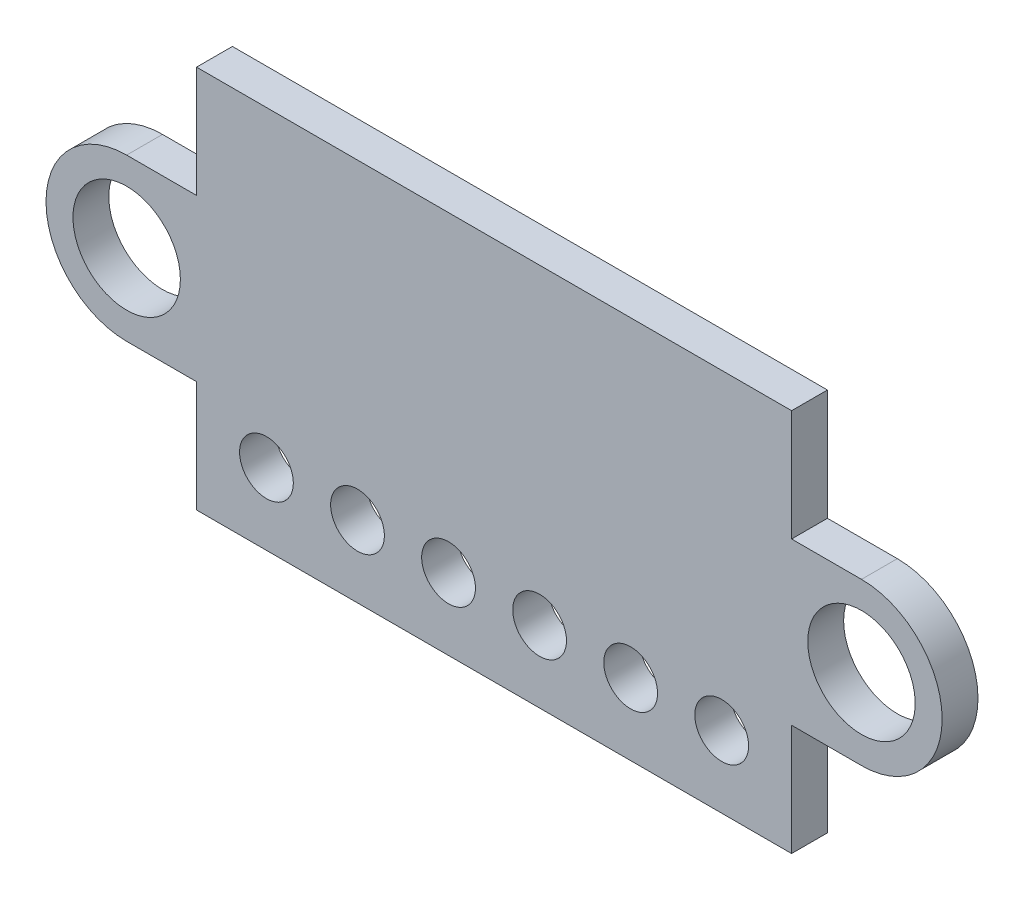
ISO-10303-21;
HEADER;
FILE_DESCRIPTION(('STEP AP214'),'2;1');
FILE_NAME('part.step','',(''),(''),'','','');
FILE_SCHEMA(('AUTOMOTIVE_DESIGN { 1 0 10303 214 1 1 1 1 }'));
ENDSEC;
DATA;
#1=APPLICATION_CONTEXT('core data for automotive mechanical design processes');
#2=APPLICATION_PROTOCOL_DEFINITION('international standard','automotive_design',2000,#1);
#3=PRODUCT_CONTEXT('',#1,'mechanical');
#4=PRODUCT('Part','Part','',(#3));
#5=PRODUCT_RELATED_PRODUCT_CATEGORY('part','',(#4));
#6=PRODUCT_DEFINITION_FORMATION('','',#4);
#7=PRODUCT_DEFINITION_CONTEXT('part definition',#1,'design');
#8=PRODUCT_DEFINITION('design','',#6,#7);
#9=PRODUCT_DEFINITION_SHAPE('','',#8);
#10=(LENGTH_UNIT() NAMED_UNIT(*) SI_UNIT(.MILLI.,.METRE.));
#11=(NAMED_UNIT(*) PLANE_ANGLE_UNIT() SI_UNIT($,.RADIAN.));
#12=(NAMED_UNIT(*) SI_UNIT($,.STERADIAN.) SOLID_ANGLE_UNIT());
#13=UNCERTAINTY_MEASURE_WITH_UNIT(LENGTH_MEASURE(1.E-05),#10,'distance_accuracy_value','');
#14=(GEOMETRIC_REPRESENTATION_CONTEXT(3) GLOBAL_UNCERTAINTY_ASSIGNED_CONTEXT((#13)) GLOBAL_UNIT_ASSIGNED_CONTEXT((#10,
#11,#12)) REPRESENTATION_CONTEXT('',''));
#15=CARTESIAN_POINT('',(0.,0.,0.));
#16=DIRECTION('',(0.,0.,1.));
#17=DIRECTION('',(1.,0.,0.));
#18=AXIS2_PLACEMENT_3D('',#15,#16,#17);
#19=CARTESIAN_POINT('',(-10.25,0.,0.));
#20=DIRECTION('',(0.,0.,1.));
#21=DIRECTION('',(1.,0.,0.));
#22=AXIS2_PLACEMENT_3D('',#19,#20,#21);
#23=PLANE('',#22);
#24=DIRECTION('',(0.,1.,0.));
#25=VECTOR('',#24,1.);
#26=CARTESIAN_POINT('',(-0.658776097833584,1.24983059149965,0.));
#27=LINE('',#26,#25);
#28=CARTESIAN_POINT('',(-0.658776097833584,-0.908813071564649,0.));
#29=VERTEX_POINT('',#28);
#30=CARTESIAN_POINT('',(-0.658776097833585,1.24983059149965,0.));
#31=VERTEX_POINT('',#30);
#32=EDGE_CURVE('E192',#29,#31,#27,.T.);
#33=ORIENTED_EDGE('',*,*,#32,.F.);
#34=DIRECTION('',(-1.,0.,0.));
#35=VECTOR('',#34,1.);
#36=CARTESIAN_POINT('',(1.22798253783359,-0.908813071564649,0.));
#37=LINE('',#36,#35);
#38=CARTESIAN_POINT('',(1.22798253783359,-0.908813071564649,0.));
#39=VERTEX_POINT('',#38);
#40=EDGE_CURVE('E205',#39,#29,#37,.T.);
#41=ORIENTED_EDGE('',*,*,#40,.F.);
#42=DIRECTION('',(0.,-1.,0.));
#43=VECTOR('',#42,1.);
#44=CARTESIAN_POINT('',(1.22798253783359,1.24983059149965,0.));
#45=LINE('',#44,#43);
#46=CARTESIAN_POINT('',(1.22798253783359,1.24983059149965,0.));
#47=VERTEX_POINT('',#46);
#48=EDGE_CURVE('E214',#47,#39,#45,.T.);
#49=ORIENTED_EDGE('',*,*,#48,.F.);
#50=DIRECTION('',(1.,0.,0.));
#51=VECTOR('',#50,1.);
#52=CARTESIAN_POINT('',(1.22798253783359,1.24983059149965,0.));
#53=LINE('',#52,#51);
#54=EDGE_CURVE('E195',#31,#47,#53,.T.);
#55=ORIENTED_EDGE('',*,*,#54,.F.);
#56=EDGE_LOOP('',(#33,#41,#49,#55));
#57=FACE_BOUND('',#56,.T.);
#58=DIRECTION('',(0.,1.,0.));
#59=VECTOR('',#58,1.);
#60=CARTESIAN_POINT('',(8.3,-2.25,0.));
#61=LINE('',#60,#59);
#62=CARTESIAN_POINT('',(8.3,-5.35,0.));
#63=VERTEX_POINT('',#62);
#64=CARTESIAN_POINT('',(8.3,-2.25,0.));
#65=VERTEX_POINT('',#64);
#66=EDGE_CURVE('E276',#63,#65,#61,.T.);
#67=ORIENTED_EDGE('',*,*,#66,.F.);
#68=DIRECTION('',(1.,0.,0.));
#69=VECTOR('',#68,1.);
#70=CARTESIAN_POINT('',(-8.3,-5.35,0.));
#71=LINE('',#70,#69);
#72=CARTESIAN_POINT('',(-8.3,-5.35,0.));
#73=VERTEX_POINT('',#72);
#74=EDGE_CURVE('E283',#73,#63,#71,.T.);
#75=ORIENTED_EDGE('',*,*,#74,.F.);
#76=DIRECTION('',(0.,-1.,0.));
#77=VECTOR('',#76,1.);
#78=CARTESIAN_POINT('',(-8.3,-2.25,0.));
#79=LINE('',#78,#77);
#80=CARTESIAN_POINT('',(-8.3,-2.25,0.));
#81=VERTEX_POINT('',#80);
#82=EDGE_CURVE('E326',#81,#73,#79,.T.);
#83=ORIENTED_EDGE('',*,*,#82,.F.);
#84=DIRECTION('',(1.,0.,0.));
#85=VECTOR('',#84,1.);
#86=CARTESIAN_POINT('',(-10.25,-2.25000000000001,0.));
#87=LINE('',#86,#85);
#88=CARTESIAN_POINT('',(-10.25,-2.25000000000001,0.));
#89=VERTEX_POINT('',#88);
#90=EDGE_CURVE('E324',#89,#81,#87,.T.);
#91=ORIENTED_EDGE('',*,*,#90,.F.);
#92=CARTESIAN_POINT('',(-10.25,0.,0.));
#93=DIRECTION('',(0.,0.,1.));
#94=DIRECTION('',(1.,0.,0.));
#95=AXIS2_PLACEMENT_3D('',#92,#93,#94);
#96=CIRCLE('',#95,2.25);
#97=CARTESIAN_POINT('',(-10.25,2.25,0.));
#98=VERTEX_POINT('',#97);
#99=EDGE_CURVE('E322',#98,#89,#96,.T.);
#100=ORIENTED_EDGE('',*,*,#99,.F.);
#101=DIRECTION('',(-1.,0.,0.));
#102=VECTOR('',#101,1.);
#103=CARTESIAN_POINT('',(-10.25,2.25,0.));
#104=LINE('',#103,#102);
#105=CARTESIAN_POINT('',(-8.3,2.25,0.));
#106=VERTEX_POINT('',#105);
#107=EDGE_CURVE('E320',#106,#98,#104,.T.);
#108=ORIENTED_EDGE('',*,*,#107,.F.);
#109=DIRECTION('',(0.,-1.,0.));
#110=VECTOR('',#109,1.);
#111=CARTESIAN_POINT('',(-8.3,5.35,0.));
#112=LINE('',#111,#110);
#113=CARTESIAN_POINT('',(-8.3,5.35,0.));
#114=VERTEX_POINT('',#113);
#115=EDGE_CURVE('E318',#114,#106,#112,.T.);
#116=ORIENTED_EDGE('',*,*,#115,.F.);
#117=DIRECTION('',(-1.,0.,0.));
#118=VECTOR('',#117,1.);
#119=CARTESIAN_POINT('',(-8.3,5.35,0.));
#120=LINE('',#119,#118);
#121=CARTESIAN_POINT('',(8.3,5.35,0.));
#122=VERTEX_POINT('',#121);
#123=EDGE_CURVE('E316',#122,#114,#120,.T.);
#124=ORIENTED_EDGE('',*,*,#123,.F.);
#125=DIRECTION('',(0.,1.,0.));
#126=VECTOR('',#125,1.);
#127=CARTESIAN_POINT('',(8.3,5.35,0.));
#128=LINE('',#127,#126);
#129=CARTESIAN_POINT('',(8.3,2.25,0.));
#130=VERTEX_POINT('',#129);
#131=EDGE_CURVE('E314',#130,#122,#128,.T.);
#132=ORIENTED_EDGE('',*,*,#131,.F.);
#133=DIRECTION('',(-1.,0.,0.));
#134=VECTOR('',#133,1.);
#135=CARTESIAN_POINT('',(10.25,2.25,0.));
#136=LINE('',#135,#134);
#137=CARTESIAN_POINT('',(10.25,2.25,0.));
#138=VERTEX_POINT('',#137);
#139=EDGE_CURVE('E312',#138,#130,#136,.T.);
#140=ORIENTED_EDGE('',*,*,#139,.F.);
#141=CARTESIAN_POINT('',(10.25,0.,0.));
#142=DIRECTION('',(0.,0.,1.));
#143=DIRECTION('',(-1.,0.,0.));
#144=AXIS2_PLACEMENT_3D('',#141,#142,#143);
#145=CIRCLE('',#144,2.25);
#146=CARTESIAN_POINT('',(10.25,-2.25,0.));
#147=VERTEX_POINT('',#146);
#148=EDGE_CURVE('E310',#147,#138,#145,.T.);
#149=ORIENTED_EDGE('',*,*,#148,.F.);
#150=DIRECTION('',(1.,0.,0.));
#151=VECTOR('',#150,1.);
#152=CARTESIAN_POINT('',(10.25,-2.25,0.));
#153=LINE('',#152,#151);
#154=EDGE_CURVE('E308',#65,#147,#153,.T.);
#155=ORIENTED_EDGE('',*,*,#154,.F.);
#156=EDGE_LOOP('',(#67,#75,#83,#91,#100,#108,#116,#124,#132,#140,#149,#155));
#157=FACE_BOUND('',#156,.T.);
#158=CARTESIAN_POINT('',(-10.25,0.,0.));
#159=DIRECTION('',(0.,0.,1.));
#160=DIRECTION('',(1.,0.,0.));
#161=AXIS2_PLACEMENT_3D('',#158,#159,#160);
#162=CIRCLE('',#161,1.49831118754806);
#163=CARTESIAN_POINT('',(-8.75168881245194,0.,0.));
#164=VERTEX_POINT('',#163);
#165=EDGE_CURVE('E270',#164,#164,#162,.T.);
#166=ORIENTED_EDGE('',*,*,#165,.T.);
#167=EDGE_LOOP('',(#166));
#168=FACE_BOUND('',#167,.T.);
#169=CARTESIAN_POINT('',(10.25,0.,0.));
#170=DIRECTION('',(0.,0.,1.));
#171=DIRECTION('',(-1.,0.,0.));
#172=AXIS2_PLACEMENT_3D('',#169,#170,#171);
#173=CIRCLE('',#172,1.49831118754806);
#174=CARTESIAN_POINT('',(8.75168881245194,0.,0.));
#175=VERTEX_POINT('',#174);
#176=EDGE_CURVE('E264',#175,#175,#173,.T.);
#177=ORIENTED_EDGE('',*,*,#176,.T.);
#178=EDGE_LOOP('',(#177));
#179=FACE_BOUND('',#178,.T.);
#180=CARTESIAN_POINT('',(-6.35,-3.35,0.));
#181=DIRECTION('',(0.,0.,1.));
#182=DIRECTION('',(1.,0.,0.));
#183=AXIS2_PLACEMENT_3D('',#180,#181,#182);
#184=CIRCLE('',#183,0.749999999999998);
#185=CARTESIAN_POINT('',(-5.6,-3.35,0.));
#186=VERTEX_POINT('',#185);
#187=EDGE_CURVE('E258',#186,#186,#184,.T.);
#188=ORIENTED_EDGE('',*,*,#187,.T.);
#189=EDGE_LOOP('',(#188));
#190=FACE_BOUND('',#189,.T.);
#191=CARTESIAN_POINT('',(-3.81,-3.35,0.));
#192=DIRECTION('',(0.,0.,1.));
#193=DIRECTION('',(1.,0.,0.));
#194=AXIS2_PLACEMENT_3D('',#191,#192,#193);
#195=CIRCLE('',#194,0.75);
#196=CARTESIAN_POINT('',(-3.06,-3.35,0.));
#197=VERTEX_POINT('',#196);
#198=EDGE_CURVE('E252',#197,#197,#195,.T.);
#199=ORIENTED_EDGE('',*,*,#198,.T.);
#200=EDGE_LOOP('',(#199));
#201=FACE_BOUND('',#200,.T.);
#202=CARTESIAN_POINT('',(-1.27,-3.35,0.));
#203=DIRECTION('',(0.,0.,1.));
#204=DIRECTION('',(1.,0.,0.));
#205=AXIS2_PLACEMENT_3D('',#202,#203,#204);
#206=CIRCLE('',#205,0.75);
#207=CARTESIAN_POINT('',(-0.52,-3.35,0.));
#208=VERTEX_POINT('',#207);
#209=EDGE_CURVE('E246',#208,#208,#206,.T.);
#210=ORIENTED_EDGE('',*,*,#209,.T.);
#211=EDGE_LOOP('',(#210));
#212=FACE_BOUND('',#211,.T.);
#213=CARTESIAN_POINT('',(1.27,-3.35,0.));
#214=DIRECTION('',(0.,0.,1.));
#215=DIRECTION('',(1.,0.,0.));
#216=AXIS2_PLACEMENT_3D('',#213,#214,#215);
#217=CIRCLE('',#216,0.750000000000001);
#218=CARTESIAN_POINT('',(2.02,-3.35,0.));
#219=VERTEX_POINT('',#218);
#220=EDGE_CURVE('E240',#219,#219,#217,.T.);
#221=ORIENTED_EDGE('',*,*,#220,.T.);
#222=EDGE_LOOP('',(#221));
#223=FACE_BOUND('',#222,.T.);
#224=CARTESIAN_POINT('',(3.81,-3.35,0.));
#225=DIRECTION('',(0.,0.,1.));
#226=DIRECTION('',(1.,0.,0.));
#227=AXIS2_PLACEMENT_3D('',#224,#225,#226);
#228=CIRCLE('',#227,0.749999999999998);
#229=CARTESIAN_POINT('',(4.56,-3.35,0.));
#230=VERTEX_POINT('',#229);
#231=EDGE_CURVE('E234',#230,#230,#228,.T.);
#232=ORIENTED_EDGE('',*,*,#231,.T.);
#233=EDGE_LOOP('',(#232));
#234=FACE_BOUND('',#233,.T.);
#235=CARTESIAN_POINT('',(6.35,-3.35,0.));
#236=DIRECTION('',(0.,0.,1.));
#237=DIRECTION('',(1.,0.,0.));
#238=AXIS2_PLACEMENT_3D('',#235,#236,#237);
#239=CIRCLE('',#238,0.749999999999998);
#240=CARTESIAN_POINT('',(7.1,-3.35,0.));
#241=VERTEX_POINT('',#240);
#242=EDGE_CURVE('E230',#241,#241,#239,.T.);
#243=ORIENTED_EDGE('',*,*,#242,.T.);
#244=EDGE_LOOP('',(#243));
#245=FACE_BOUND('',#244,.T.);
#246=DIRECTION('',(0.,1.,0.));
#247=VECTOR('',#246,1.);
#248=CARTESIAN_POINT('',(-6.24322750506876,2.40541771139391,0.));
#249=LINE('',#248,#247);
#250=CARTESIAN_POINT('',(-6.24322750506876,0.675797694555059,0.));
#251=VERTEX_POINT('',#250);
#252=CARTESIAN_POINT('',(-6.24322750506876,2.40541771139391,0.));
#253=VERTEX_POINT('',#252);
#254=EDGE_CURVE('E191',#251,#253,#249,.T.);
#255=ORIENTED_EDGE('',*,*,#254,.F.);
#256=DIRECTION('',(-1.,0.,0.));
#257=VECTOR('',#256,1.);
#258=CARTESIAN_POINT('',(-3.88518784000012,0.675797694555059,0.));
#259=LINE('',#258,#257);
#260=CARTESIAN_POINT('',(-3.88518784000012,0.675797694555059,0.));
#261=VERTEX_POINT('',#260);
#262=EDGE_CURVE('E188',#261,#251,#259,.T.);
#263=ORIENTED_EDGE('',*,*,#262,.F.);
#264=DIRECTION('',(0.,-1.,0.));
#265=VECTOR('',#264,1.);
#266=CARTESIAN_POINT('',(-3.88518784000012,2.40541771139391,0.));
#267=LINE('',#266,#265);
#268=CARTESIAN_POINT('',(-3.88518784000012,2.40541771139391,0.));
#269=VERTEX_POINT('',#268);
#270=EDGE_CURVE('E54',#269,#261,#267,.T.);
#271=ORIENTED_EDGE('',*,*,#270,.F.);
#272=DIRECTION('',(1.,0.,0.));
#273=VECTOR('',#272,1.);
#274=CARTESIAN_POINT('',(-3.88518784000012,2.40541771139391,0.));
#275=LINE('',#274,#273);
#276=EDGE_CURVE('E49',#253,#269,#275,.T.);
#277=ORIENTED_EDGE('',*,*,#276,.F.);
#278=EDGE_LOOP('',(#255,#263,#271,#277));
#279=FACE_BOUND('',#278,.T.);
#280=ADVANCED_FACE('F34',(#57,#157,#168,#179,#190,#201,#212,#223,#234,#245,#279),#23,.F.);
#281=CARTESIAN_POINT('',(-10.25,0.,1.));
#282=DIRECTION('',(0.,0.,1.));
#283=DIRECTION('',(1.,0.,0.));
#284=AXIS2_PLACEMENT_3D('',#281,#282,#283);
#285=PLANE('',#284);
#286=CARTESIAN_POINT('',(3.81,-3.35,1.));
#287=DIRECTION('',(0.,0.,1.));
#288=DIRECTION('',(1.,0.,0.));
#289=AXIS2_PLACEMENT_3D('',#286,#287,#288);
#290=CIRCLE('',#289,0.749999999999998);
#291=CARTESIAN_POINT('',(4.56,-3.35,1.));
#292=VERTEX_POINT('',#291);
#293=EDGE_CURVE('E237',#292,#292,#290,.T.);
#294=ORIENTED_EDGE('',*,*,#293,.F.);
#295=EDGE_LOOP('',(#294));
#296=FACE_BOUND('',#295,.T.);
#297=CARTESIAN_POINT('',(-1.27,-3.35,1.));
#298=DIRECTION('',(0.,0.,1.));
#299=DIRECTION('',(1.,0.,0.));
#300=AXIS2_PLACEMENT_3D('',#297,#298,#299);
#301=CIRCLE('',#300,0.75);
#302=CARTESIAN_POINT('',(-0.52,-3.35,1.));
#303=VERTEX_POINT('',#302);
#304=EDGE_CURVE('E249',#303,#303,#301,.T.);
#305=ORIENTED_EDGE('',*,*,#304,.F.);
#306=EDGE_LOOP('',(#305));
#307=FACE_BOUND('',#306,.T.);
#308=CARTESIAN_POINT('',(-6.35,-3.35,1.));
#309=DIRECTION('',(0.,0.,1.));
#310=DIRECTION('',(1.,0.,0.));
#311=AXIS2_PLACEMENT_3D('',#308,#309,#310);
#312=CIRCLE('',#311,0.749999999999998);
#313=CARTESIAN_POINT('',(-5.6,-3.35,1.));
#314=VERTEX_POINT('',#313);
#315=EDGE_CURVE('E261',#314,#314,#312,.T.);
#316=ORIENTED_EDGE('',*,*,#315,.F.);
#317=EDGE_LOOP('',(#316));
#318=FACE_BOUND('',#317,.T.);
#319=CARTESIAN_POINT('',(-10.25,0.,1.));
#320=DIRECTION('',(0.,0.,1.));
#321=DIRECTION('',(1.,0.,0.));
#322=AXIS2_PLACEMENT_3D('',#319,#320,#321);
#323=CIRCLE('',#322,1.49831118754806);
#324=CARTESIAN_POINT('',(-8.75168881245194,0.,1.));
#325=VERTEX_POINT('',#324);
#326=EDGE_CURVE('E273',#325,#325,#323,.T.);
#327=ORIENTED_EDGE('',*,*,#326,.F.);
#328=EDGE_LOOP('',(#327));
#329=FACE_BOUND('',#328,.T.);
#330=DIRECTION('',(0.,1.,0.));
#331=VECTOR('',#330,1.);
#332=CARTESIAN_POINT('',(8.3,-2.25,1.));
#333=LINE('',#332,#331);
#334=CARTESIAN_POINT('',(8.3,-5.35,1.));
#335=VERTEX_POINT('',#334);
#336=CARTESIAN_POINT('',(8.3,-2.25,1.));
#337=VERTEX_POINT('',#336);
#338=EDGE_CURVE('E279',#335,#337,#333,.T.);
#339=ORIENTED_EDGE('',*,*,#338,.T.);
#340=DIRECTION('',(1.,0.,0.));
#341=VECTOR('',#340,1.);
#342=CARTESIAN_POINT('',(10.25,-2.25,1.));
#343=LINE('',#342,#341);
#344=CARTESIAN_POINT('',(10.25,-2.25,1.));
#345=VERTEX_POINT('',#344);
#346=EDGE_CURVE('E282',#337,#345,#343,.T.);
#347=ORIENTED_EDGE('',*,*,#346,.T.);
#348=CARTESIAN_POINT('',(10.25,0.,1.));
#349=DIRECTION('',(0.,0.,1.));
#350=DIRECTION('',(-1.,0.,0.));
#351=AXIS2_PLACEMENT_3D('',#348,#349,#350);
#352=CIRCLE('',#351,2.25);
#353=CARTESIAN_POINT('',(10.25,2.25,1.));
#354=VERTEX_POINT('',#353);
#355=EDGE_CURVE('E285',#345,#354,#352,.T.);
#356=ORIENTED_EDGE('',*,*,#355,.T.);
#357=DIRECTION('',(-1.,0.,0.));
#358=VECTOR('',#357,1.);
#359=CARTESIAN_POINT('',(10.25,2.25,1.));
#360=LINE('',#359,#358);
#361=CARTESIAN_POINT('',(8.3,2.25,1.));
#362=VERTEX_POINT('',#361);
#363=EDGE_CURVE('E287',#354,#362,#360,.T.);
#364=ORIENTED_EDGE('',*,*,#363,.T.);
#365=DIRECTION('',(0.,1.,0.));
#366=VECTOR('',#365,1.);
#367=CARTESIAN_POINT('',(8.3,5.35,1.));
#368=LINE('',#367,#366);
#369=CARTESIAN_POINT('',(8.3,5.35,1.));
#370=VERTEX_POINT('',#369);
#371=EDGE_CURVE('E289',#362,#370,#368,.T.);
#372=ORIENTED_EDGE('',*,*,#371,.T.);
#373=DIRECTION('',(-1.,0.,0.));
#374=VECTOR('',#373,1.);
#375=CARTESIAN_POINT('',(-8.3,5.35,1.));
#376=LINE('',#375,#374);
#377=CARTESIAN_POINT('',(-8.3,5.35,1.));
#378=VERTEX_POINT('',#377);
#379=EDGE_CURVE('E291',#370,#378,#376,.T.);
#380=ORIENTED_EDGE('',*,*,#379,.T.);
#381=DIRECTION('',(0.,-1.,0.));
#382=VECTOR('',#381,1.);
#383=CARTESIAN_POINT('',(-8.3,5.35,1.));
#384=LINE('',#383,#382);
#385=CARTESIAN_POINT('',(-8.3,2.25,1.));
#386=VERTEX_POINT('',#385);
#387=EDGE_CURVE('E293',#378,#386,#384,.T.);
#388=ORIENTED_EDGE('',*,*,#387,.T.);
#389=DIRECTION('',(-1.,0.,0.));
#390=VECTOR('',#389,1.);
#391=CARTESIAN_POINT('',(-10.25,2.25,1.));
#392=LINE('',#391,#390);
#393=CARTESIAN_POINT('',(-10.25,2.25,1.));
#394=VERTEX_POINT('',#393);
#395=EDGE_CURVE('E295',#386,#394,#392,.T.);
#396=ORIENTED_EDGE('',*,*,#395,.T.);
#397=CARTESIAN_POINT('',(-10.25,0.,1.));
#398=DIRECTION('',(0.,0.,1.));
#399=DIRECTION('',(1.,0.,0.));
#400=AXIS2_PLACEMENT_3D('',#397,#398,#399);
#401=CIRCLE('',#400,2.25);
#402=CARTESIAN_POINT('',(-10.25,-2.25000000000001,1.));
#403=VERTEX_POINT('',#402);
#404=EDGE_CURVE('E297',#394,#403,#401,.T.);
#405=ORIENTED_EDGE('',*,*,#404,.T.);
#406=DIRECTION('',(1.,0.,0.));
#407=VECTOR('',#406,1.);
#408=CARTESIAN_POINT('',(-10.25,-2.25000000000001,1.));
#409=LINE('',#408,#407);
#410=CARTESIAN_POINT('',(-8.3,-2.25,1.));
#411=VERTEX_POINT('',#410);
#412=EDGE_CURVE('E299',#403,#411,#409,.T.);
#413=ORIENTED_EDGE('',*,*,#412,.T.);
#414=DIRECTION('',(0.,-1.,0.));
#415=VECTOR('',#414,1.);
#416=CARTESIAN_POINT('',(-8.3,-2.25,1.));
#417=LINE('',#416,#415);
#418=CARTESIAN_POINT('',(-8.3,-5.35,1.));
#419=VERTEX_POINT('',#418);
#420=EDGE_CURVE('E301',#411,#419,#417,.T.);
#421=ORIENTED_EDGE('',*,*,#420,.T.);
#422=DIRECTION('',(1.,0.,0.));
#423=VECTOR('',#422,1.);
#424=CARTESIAN_POINT('',(-8.3,-5.35,1.));
#425=LINE('',#424,#423);
#426=EDGE_CURVE('E303',#419,#335,#425,.T.);
#427=ORIENTED_EDGE('',*,*,#426,.T.);
#428=EDGE_LOOP('',(#339,#347,#356,#364,#372,#380,#388,#396,#405,#413,#421,#427));
#429=FACE_BOUND('',#428,.T.);
#430=CARTESIAN_POINT('',(10.25,0.,1.));
#431=DIRECTION('',(0.,0.,1.));
#432=DIRECTION('',(-1.,0.,0.));
#433=AXIS2_PLACEMENT_3D('',#430,#431,#432);
#434=CIRCLE('',#433,1.49831118754806);
#435=CARTESIAN_POINT('',(8.75168881245194,0.,1.));
#436=VERTEX_POINT('',#435);
#437=EDGE_CURVE('E267',#436,#436,#434,.T.);
#438=ORIENTED_EDGE('',*,*,#437,.F.);
#439=EDGE_LOOP('',(#438));
#440=FACE_BOUND('',#439,.T.);
#441=CARTESIAN_POINT('',(-3.81,-3.35,1.));
#442=DIRECTION('',(0.,0.,1.));
#443=DIRECTION('',(1.,0.,0.));
#444=AXIS2_PLACEMENT_3D('',#441,#442,#443);
#445=CIRCLE('',#444,0.75);
#446=CARTESIAN_POINT('',(-3.06,-3.35,1.));
#447=VERTEX_POINT('',#446);
#448=EDGE_CURVE('E255',#447,#447,#445,.T.);
#449=ORIENTED_EDGE('',*,*,#448,.F.);
#450=EDGE_LOOP('',(#449));
#451=FACE_BOUND('',#450,.T.);
#452=CARTESIAN_POINT('',(1.27,-3.35,1.));
#453=DIRECTION('',(0.,0.,1.));
#454=DIRECTION('',(1.,0.,0.));
#455=AXIS2_PLACEMENT_3D('',#452,#453,#454);
#456=CIRCLE('',#455,0.750000000000001);
#457=CARTESIAN_POINT('',(2.02,-3.35,1.));
#458=VERTEX_POINT('',#457);
#459=EDGE_CURVE('E243',#458,#458,#456,.T.);
#460=ORIENTED_EDGE('',*,*,#459,.F.);
#461=EDGE_LOOP('',(#460));
#462=FACE_BOUND('',#461,.T.);
#463=CARTESIAN_POINT('',(6.35,-3.35,1.));
#464=DIRECTION('',(0.,0.,1.));
#465=DIRECTION('',(1.,0.,0.));
#466=AXIS2_PLACEMENT_3D('',#463,#464,#465);
#467=CIRCLE('',#466,0.749999999999998);
#468=CARTESIAN_POINT('',(7.1,-3.35,1.));
#469=VERTEX_POINT('',#468);
#470=EDGE_CURVE('E231',#469,#469,#467,.T.);
#471=ORIENTED_EDGE('',*,*,#470,.F.);
#472=EDGE_LOOP('',(#471));
#473=FACE_BOUND('',#472,.T.);
#474=ADVANCED_FACE('F381',(#296,#307,#318,#329,#429,#440,#451,#462,#473),#285,.T.);
#475=CARTESIAN_POINT('',(8.3,-2.25,1.));
#476=DIRECTION('',(-1.,0.,0.));
#477=DIRECTION('',(0.,-1.,0.));
#478=AXIS2_PLACEMENT_3D('',#475,#476,#477);
#479=PLANE('',#478);
#480=ORIENTED_EDGE('',*,*,#66,.T.);
#481=DIRECTION('',(0.,0.,-1.));
#482=VECTOR('',#481,1.);
#483=CARTESIAN_POINT('',(8.3,-2.25,1.));
#484=LINE('',#483,#482);
#485=EDGE_CURVE('E11',#337,#65,#484,.T.);
#486=ORIENTED_EDGE('',*,*,#485,.F.);
#487=ORIENTED_EDGE('',*,*,#338,.F.);
#488=DIRECTION('',(0.,0.,-1.));
#489=VECTOR('',#488,1.);
#490=CARTESIAN_POINT('',(8.3,-5.35,1.));
#491=LINE('',#490,#489);
#492=EDGE_CURVE('E305',#335,#63,#491,.T.);
#493=ORIENTED_EDGE('',*,*,#492,.T.);
#494=EDGE_LOOP('',(#480,#486,#487,#493));
#495=FACE_BOUND('',#494,.T.);
#496=ADVANCED_FACE('F36',(#495),#479,.F.);
#497=CARTESIAN_POINT('',(10.25,-2.25,1.));
#498=DIRECTION('',(0.,1.,0.));
#499=DIRECTION('',(-1.,0.,0.));
#500=AXIS2_PLACEMENT_3D('',#497,#498,#499);
#501=PLANE('',#500);
#502=ORIENTED_EDGE('',*,*,#154,.T.);
#503=DIRECTION('',(0.,0.,-1.));
#504=VECTOR('',#503,1.);
#505=CARTESIAN_POINT('',(10.25,-2.25,1.));
#506=LINE('',#505,#504);
#507=EDGE_CURVE('E42',#345,#147,#506,.T.);
#508=ORIENTED_EDGE('',*,*,#507,.F.);
#509=ORIENTED_EDGE('',*,*,#346,.F.);
#510=ORIENTED_EDGE('',*,*,#485,.T.);
#511=EDGE_LOOP('',(#502,#508,#509,#510));
#512=FACE_BOUND('',#511,.T.);
#513=ADVANCED_FACE('F386',(#512),#501,.F.);
#514=CARTESIAN_POINT('',(10.25,0.,1.));
#515=DIRECTION('',(0.,0.,-1.));
#516=DIRECTION('',(-1.,0.,0.));
#517=AXIS2_PLACEMENT_3D('',#514,#515,#516);
#518=CYLINDRICAL_SURFACE('',#517,2.25);
#519=ORIENTED_EDGE('',*,*,#148,.T.);
#520=DIRECTION('',(0.,0.,-1.));
#521=VECTOR('',#520,1.);
#522=CARTESIAN_POINT('',(10.25,2.25,1.));
#523=LINE('',#522,#521);
#524=EDGE_CURVE('E355',#354,#138,#523,.T.);
#525=ORIENTED_EDGE('',*,*,#524,.F.);
#526=ORIENTED_EDGE('',*,*,#355,.F.);
#527=ORIENTED_EDGE('',*,*,#507,.T.);
#528=EDGE_LOOP('',(#519,#525,#526,#527));
#529=FACE_BOUND('',#528,.T.);
#530=ADVANCED_FACE('F362',(#529),#518,.T.);
#531=CARTESIAN_POINT('',(10.25,2.25,1.));
#532=DIRECTION('',(0.,-1.,0.));
#533=DIRECTION('',(1.,0.,0.));
#534=AXIS2_PLACEMENT_3D('',#531,#532,#533);
#535=PLANE('',#534);
#536=ORIENTED_EDGE('',*,*,#139,.T.);
#537=DIRECTION('',(0.,0.,-1.));
#538=VECTOR('',#537,1.);
#539=CARTESIAN_POINT('',(8.3,2.25,1.));
#540=LINE('',#539,#538);
#541=EDGE_CURVE('E352',#362,#130,#540,.T.);
#542=ORIENTED_EDGE('',*,*,#541,.F.);
#543=ORIENTED_EDGE('',*,*,#363,.F.);
#544=ORIENTED_EDGE('',*,*,#524,.T.);
#545=EDGE_LOOP('',(#536,#542,#543,#544));
#546=FACE_BOUND('',#545,.T.);
#547=ADVANCED_FACE('F373',(#546),#535,.F.);
#548=CARTESIAN_POINT('',(8.3,5.35,1.));
#549=DIRECTION('',(-1.,0.,0.));
#550=DIRECTION('',(0.,0.,1.));
#551=AXIS2_PLACEMENT_3D('',#548,#549,#550);
#552=PLANE('',#551);
#553=ORIENTED_EDGE('',*,*,#131,.T.);
#554=DIRECTION('',(0.,0.,-1.));
#555=VECTOR('',#554,1.);
#556=CARTESIAN_POINT('',(8.3,5.35,1.));
#557=LINE('',#556,#555);
#558=EDGE_CURVE('E349',#370,#122,#557,.T.);
#559=ORIENTED_EDGE('',*,*,#558,.F.);
#560=ORIENTED_EDGE('',*,*,#371,.F.);
#561=ORIENTED_EDGE('',*,*,#541,.T.);
#562=EDGE_LOOP('',(#553,#559,#560,#561));
#563=FACE_BOUND('',#562,.T.);
#564=ADVANCED_FACE('F377',(#563),#552,.F.);
#565=CARTESIAN_POINT('',(-8.3,5.35,1.));
#566=DIRECTION('',(0.,-1.,0.));
#567=DIRECTION('',(1.,0.,0.));
#568=AXIS2_PLACEMENT_3D('',#565,#566,#567);
#569=PLANE('',#568);
#570=ORIENTED_EDGE('',*,*,#123,.T.);
#571=DIRECTION('',(0.,0.,-1.));
#572=VECTOR('',#571,1.);
#573=CARTESIAN_POINT('',(-8.3,5.35,1.));
#574=LINE('',#573,#572);
#575=EDGE_CURVE('E346',#378,#114,#574,.T.);
#576=ORIENTED_EDGE('',*,*,#575,.F.);
#577=ORIENTED_EDGE('',*,*,#379,.F.);
#578=ORIENTED_EDGE('',*,*,#558,.T.);
#579=EDGE_LOOP('',(#570,#576,#577,#578));
#580=FACE_BOUND('',#579,.T.);
#581=ADVANCED_FACE('F419',(#580),#569,.F.);
#582=CARTESIAN_POINT('',(-8.3,5.35,1.));
#583=DIRECTION('',(1.,0.,0.));
#584=DIRECTION('',(0.,0.,-1.));
#585=AXIS2_PLACEMENT_3D('',#582,#583,#584);
#586=PLANE('',#585);
#587=ORIENTED_EDGE('',*,*,#115,.T.);
#588=DIRECTION('',(0.,0.,-1.));
#589=VECTOR('',#588,1.);
#590=CARTESIAN_POINT('',(-8.3,2.25,1.));
#591=LINE('',#590,#589);
#592=EDGE_CURVE('E343',#386,#106,#591,.T.);
#593=ORIENTED_EDGE('',*,*,#592,.F.);
#594=ORIENTED_EDGE('',*,*,#387,.F.);
#595=ORIENTED_EDGE('',*,*,#575,.T.);
#596=EDGE_LOOP('',(#587,#593,#594,#595));
#597=FACE_BOUND('',#596,.T.);
#598=ADVANCED_FACE('F417',(#597),#586,.F.);
#599=CARTESIAN_POINT('',(-10.25,2.25,1.));
#600=DIRECTION('',(0.,-1.,0.));
#601=DIRECTION('',(1.,0.,0.));
#602=AXIS2_PLACEMENT_3D('',#599,#600,#601);
#603=PLANE('',#602);
#604=ORIENTED_EDGE('',*,*,#107,.T.);
#605=DIRECTION('',(0.,0.,-1.));
#606=VECTOR('',#605,1.);
#607=CARTESIAN_POINT('',(-10.25,2.25,1.));
#608=LINE('',#607,#606);
#609=EDGE_CURVE('E340',#394,#98,#608,.T.);
#610=ORIENTED_EDGE('',*,*,#609,.F.);
#611=ORIENTED_EDGE('',*,*,#395,.F.);
#612=ORIENTED_EDGE('',*,*,#592,.T.);
#613=EDGE_LOOP('',(#604,#610,#611,#612));
#614=FACE_BOUND('',#613,.T.);
#615=ADVANCED_FACE('F413',(#614),#603,.F.);
#616=CARTESIAN_POINT('',(-10.25,0.,1.));
#617=DIRECTION('',(0.,0.,-1.));
#618=DIRECTION('',(-1.,0.,0.));
#619=AXIS2_PLACEMENT_3D('',#616,#617,#618);
#620=CYLINDRICAL_SURFACE('',#619,2.25);
#621=ORIENTED_EDGE('',*,*,#99,.T.);
#622=DIRECTION('',(0.,0.,-1.));
#623=VECTOR('',#622,1.);
#624=CARTESIAN_POINT('',(-10.25,-2.25000000000001,1.));
#625=LINE('',#624,#623);
#626=EDGE_CURVE('E337',#403,#89,#625,.T.);
#627=ORIENTED_EDGE('',*,*,#626,.F.);
#628=ORIENTED_EDGE('',*,*,#404,.F.);
#629=ORIENTED_EDGE('',*,*,#609,.T.);
#630=EDGE_LOOP('',(#621,#627,#628,#629));
#631=FACE_BOUND('',#630,.T.);
#632=ADVANCED_FACE('F408',(#631),#620,.T.);
#633=CARTESIAN_POINT('',(-10.25,-2.25000000000001,1.));
#634=DIRECTION('',(0.,1.,0.));
#635=DIRECTION('',(-1.,0.,0.));
#636=AXIS2_PLACEMENT_3D('',#633,#634,#635);
#637=PLANE('',#636);
#638=ORIENTED_EDGE('',*,*,#90,.T.);
#639=DIRECTION('',(0.,0.,-1.));
#640=VECTOR('',#639,1.);
#641=CARTESIAN_POINT('',(-8.3,-2.25,1.));
#642=LINE('',#641,#640);
#643=EDGE_CURVE('E334',#411,#81,#642,.T.);
#644=ORIENTED_EDGE('',*,*,#643,.F.);
#645=ORIENTED_EDGE('',*,*,#412,.F.);
#646=ORIENTED_EDGE('',*,*,#626,.T.);
#647=EDGE_LOOP('',(#638,#644,#645,#646));
#648=FACE_BOUND('',#647,.T.);
#649=ADVANCED_FACE('F402',(#648),#637,.F.);
#650=CARTESIAN_POINT('',(-8.3,-2.25,1.));
#651=DIRECTION('',(1.,0.,0.));
#652=DIRECTION('',(0.,1.,0.));
#653=AXIS2_PLACEMENT_3D('',#650,#651,#652);
#654=PLANE('',#653);
#655=ORIENTED_EDGE('',*,*,#82,.T.);
#656=DIRECTION('',(0.,0.,-1.));
#657=VECTOR('',#656,1.);
#658=CARTESIAN_POINT('',(-8.3,-5.35,1.));
#659=LINE('',#658,#657);
#660=EDGE_CURVE('E331',#419,#73,#659,.T.);
#661=ORIENTED_EDGE('',*,*,#660,.F.);
#662=ORIENTED_EDGE('',*,*,#420,.F.);
#663=ORIENTED_EDGE('',*,*,#643,.T.);
#664=EDGE_LOOP('',(#655,#661,#662,#663));
#665=FACE_BOUND('',#664,.T.);
#666=ADVANCED_FACE('F398',(#665),#654,.F.);
#667=CARTESIAN_POINT('',(-8.3,-5.35,1.));
#668=DIRECTION('',(0.,1.,0.));
#669=DIRECTION('',(-1.,0.,0.));
#670=AXIS2_PLACEMENT_3D('',#667,#668,#669);
#671=PLANE('',#670);
#672=ORIENTED_EDGE('',*,*,#74,.T.);
#673=ORIENTED_EDGE('',*,*,#492,.F.);
#674=ORIENTED_EDGE('',*,*,#426,.F.);
#675=ORIENTED_EDGE('',*,*,#660,.T.);
#676=EDGE_LOOP('',(#672,#673,#674,#675));
#677=FACE_BOUND('',#676,.T.);
#678=ADVANCED_FACE('F393',(#677),#671,.F.);
#679=CARTESIAN_POINT('',(-10.25,0.,1.));
#680=DIRECTION('',(0.,0.,-1.));
#681=DIRECTION('',(-1.,0.,0.));
#682=AXIS2_PLACEMENT_3D('',#679,#680,#681);
#683=CYLINDRICAL_SURFACE('',#682,1.49831118754806);
#684=ORIENTED_EDGE('',*,*,#326,.T.);
#685=EDGE_LOOP('',(#684));
#686=FACE_BOUND('',#685,.T.);
#687=ORIENTED_EDGE('',*,*,#165,.F.);
#688=EDGE_LOOP('',(#687));
#689=FACE_BOUND('',#688,.T.);
#690=ADVANCED_FACE('F440',(#686,#689),#683,.F.);
#691=CARTESIAN_POINT('',(10.25,0.,1.));
#692=DIRECTION('',(0.,0.,-1.));
#693=DIRECTION('',(-1.,0.,0.));
#694=AXIS2_PLACEMENT_3D('',#691,#692,#693);
#695=CYLINDRICAL_SURFACE('',#694,1.49831118754806);
#696=ORIENTED_EDGE('',*,*,#437,.T.);
#697=EDGE_LOOP('',(#696));
#698=FACE_BOUND('',#697,.T.);
#699=ORIENTED_EDGE('',*,*,#176,.F.);
#700=EDGE_LOOP('',(#699));
#701=FACE_BOUND('',#700,.T.);
#702=ADVANCED_FACE('F474',(#698,#701),#695,.F.);
#703=CARTESIAN_POINT('',(-6.35,-3.35,1.));
#704=DIRECTION('',(0.,0.,-1.));
#705=DIRECTION('',(-1.,0.,0.));
#706=AXIS2_PLACEMENT_3D('',#703,#704,#705);
#707=CYLINDRICAL_SURFACE('',#706,0.749999999999998);
#708=ORIENTED_EDGE('',*,*,#315,.T.);
#709=EDGE_LOOP('',(#708));
#710=FACE_BOUND('',#709,.T.);
#711=ORIENTED_EDGE('',*,*,#187,.F.);
#712=EDGE_LOOP('',(#711));
#713=FACE_BOUND('',#712,.T.);
#714=ADVANCED_FACE('F481',(#710,#713),#707,.F.);
#715=CARTESIAN_POINT('',(-3.81,-3.35,1.));
#716=DIRECTION('',(0.,0.,-1.));
#717=DIRECTION('',(-1.,0.,0.));
#718=AXIS2_PLACEMENT_3D('',#715,#716,#717);
#719=CYLINDRICAL_SURFACE('',#718,0.75);
#720=ORIENTED_EDGE('',*,*,#448,.T.);
#721=EDGE_LOOP('',(#720));
#722=FACE_BOUND('',#721,.T.);
#723=ORIENTED_EDGE('',*,*,#198,.F.);
#724=EDGE_LOOP('',(#723));
#725=FACE_BOUND('',#724,.T.);
#726=ADVANCED_FACE('F489',(#722,#725),#719,.F.);
#727=CARTESIAN_POINT('',(-1.27,-3.35,1.));
#728=DIRECTION('',(0.,0.,-1.));
#729=DIRECTION('',(-1.,0.,0.));
#730=AXIS2_PLACEMENT_3D('',#727,#728,#729);
#731=CYLINDRICAL_SURFACE('',#730,0.75);
#732=ORIENTED_EDGE('',*,*,#304,.T.);
#733=EDGE_LOOP('',(#732));
#734=FACE_BOUND('',#733,.T.);
#735=ORIENTED_EDGE('',*,*,#209,.F.);
#736=EDGE_LOOP('',(#735));
#737=FACE_BOUND('',#736,.T.);
#738=ADVANCED_FACE('F497',(#734,#737),#731,.F.);
#739=CARTESIAN_POINT('',(1.27,-3.35,1.));
#740=DIRECTION('',(0.,0.,-1.));
#741=DIRECTION('',(-1.,0.,0.));
#742=AXIS2_PLACEMENT_3D('',#739,#740,#741);
#743=CYLINDRICAL_SURFACE('',#742,0.750000000000001);
#744=ORIENTED_EDGE('',*,*,#459,.T.);
#745=EDGE_LOOP('',(#744));
#746=FACE_BOUND('',#745,.T.);
#747=ORIENTED_EDGE('',*,*,#220,.F.);
#748=EDGE_LOOP('',(#747));
#749=FACE_BOUND('',#748,.T.);
#750=ADVANCED_FACE('F505',(#746,#749),#743,.F.);
#751=CARTESIAN_POINT('',(3.81,-3.35,1.));
#752=DIRECTION('',(0.,0.,-1.));
#753=DIRECTION('',(-1.,0.,0.));
#754=AXIS2_PLACEMENT_3D('',#751,#752,#753);
#755=CYLINDRICAL_SURFACE('',#754,0.749999999999998);
#756=ORIENTED_EDGE('',*,*,#293,.T.);
#757=EDGE_LOOP('',(#756));
#758=FACE_BOUND('',#757,.T.);
#759=ORIENTED_EDGE('',*,*,#231,.F.);
#760=EDGE_LOOP('',(#759));
#761=FACE_BOUND('',#760,.T.);
#762=ADVANCED_FACE('F513',(#758,#761),#755,.F.);
#763=CARTESIAN_POINT('',(6.35,-3.35,1.));
#764=DIRECTION('',(0.,0.,-1.));
#765=DIRECTION('',(-1.,0.,0.));
#766=AXIS2_PLACEMENT_3D('',#763,#764,#765);
#767=CYLINDRICAL_SURFACE('',#766,0.749999999999998);
#768=ORIENTED_EDGE('',*,*,#470,.T.);
#769=EDGE_LOOP('',(#768));
#770=FACE_BOUND('',#769,.T.);
#771=ORIENTED_EDGE('',*,*,#242,.F.);
#772=EDGE_LOOP('',(#771));
#773=FACE_BOUND('',#772,.T.);
#774=ADVANCED_FACE('F521',(#770,#773),#767,.F.);
#775=CARTESIAN_POINT('',(-0.658776097833584,1.24983059149965,-1.));
#776=DIRECTION('',(1.,0.,0.));
#777=DIRECTION('',(0.,1.,0.));
#778=AXIS2_PLACEMENT_3D('',#775,#776,#777);
#779=PLANE('',#778);
#780=ORIENTED_EDGE('',*,*,#32,.T.);
#781=DIRECTION('',(0.,0.,1.));
#782=VECTOR('',#781,1.);
#783=CARTESIAN_POINT('',(-0.658776097833584,1.24983059149965,-1.));
#784=LINE('',#783,#782);
#785=CARTESIAN_POINT('',(-0.658776097833584,1.24983059149965,-1.));
#786=VERTEX_POINT('',#785);
#787=EDGE_CURVE('E227',#786,#31,#784,.T.);
#788=ORIENTED_EDGE('',*,*,#787,.F.);
#789=DIRECTION('',(0.,1.,0.));
#790=VECTOR('',#789,1.);
#791=CARTESIAN_POINT('',(-0.658776097833584,1.24983059149965,-1.));
#792=LINE('',#791,#790);
#793=CARTESIAN_POINT('',(-0.658776097833584,-0.908813071564649,-1.));
#794=VERTEX_POINT('',#793);
#795=EDGE_CURVE('E201',#794,#786,#792,.T.);
#796=ORIENTED_EDGE('',*,*,#795,.F.);
#797=DIRECTION('',(0.,0.,1.));
#798=VECTOR('',#797,1.);
#799=CARTESIAN_POINT('',(-0.658776097833584,-0.908813071564649,-1.));
#800=LINE('',#799,#798);
#801=EDGE_CURVE('E210',#794,#29,#800,.T.);
#802=ORIENTED_EDGE('',*,*,#801,.T.);
#803=EDGE_LOOP('',(#780,#788,#796,#802));
#804=FACE_BOUND('',#803,.T.);
#805=ADVANCED_FACE('F529',(#804),#779,.F.);
#806=CARTESIAN_POINT('',(1.22798253783359,1.24983059149965,-1.));
#807=DIRECTION('',(0.,-1.,0.));
#808=DIRECTION('',(0.,0.,-1.));
#809=AXIS2_PLACEMENT_3D('',#806,#807,#808);
#810=PLANE('',#809);
#811=ORIENTED_EDGE('',*,*,#54,.T.);
#812=DIRECTION('',(0.,0.,1.));
#813=VECTOR('',#812,1.);
#814=CARTESIAN_POINT('',(1.22798253783359,1.24983059149965,-1.));
#815=LINE('',#814,#813);
#816=CARTESIAN_POINT('',(1.22798253783359,1.24983059149965,-1.));
#817=VERTEX_POINT('',#816);
#818=EDGE_CURVE('E224',#817,#47,#815,.T.);
#819=ORIENTED_EDGE('',*,*,#818,.F.);
#820=DIRECTION('',(1.,0.,0.));
#821=VECTOR('',#820,1.);
#822=CARTESIAN_POINT('',(1.22798253783359,1.24983059149965,-1.));
#823=LINE('',#822,#821);
#824=EDGE_CURVE('E204',#786,#817,#823,.T.);
#825=ORIENTED_EDGE('',*,*,#824,.F.);
#826=ORIENTED_EDGE('',*,*,#787,.T.);
#827=EDGE_LOOP('',(#811,#819,#825,#826));
#828=FACE_BOUND('',#827,.T.);
#829=ADVANCED_FACE('F537',(#828),#810,.F.);
#830=CARTESIAN_POINT('',(1.22798253783359,1.24983059149965,-1.));
#831=DIRECTION('',(-1.,0.,0.));
#832=DIRECTION('',(0.,-1.,0.));
#833=AXIS2_PLACEMENT_3D('',#830,#831,#832);
#834=PLANE('',#833);
#835=ORIENTED_EDGE('',*,*,#48,.T.);
#836=DIRECTION('',(0.,0.,1.));
#837=VECTOR('',#836,1.);
#838=CARTESIAN_POINT('',(1.22798253783359,-0.908813071564649,-1.));
#839=LINE('',#838,#837);
#840=CARTESIAN_POINT('',(1.22798253783359,-0.908813071564649,-1.));
#841=VERTEX_POINT('',#840);
#842=EDGE_CURVE('E221',#841,#39,#839,.T.);
#843=ORIENTED_EDGE('',*,*,#842,.F.);
#844=DIRECTION('',(0.,-1.,0.));
#845=VECTOR('',#844,1.);
#846=CARTESIAN_POINT('',(1.22798253783359,1.24983059149965,-1.));
#847=LINE('',#846,#845);
#848=EDGE_CURVE('E207',#817,#841,#847,.T.);
#849=ORIENTED_EDGE('',*,*,#848,.F.);
#850=ORIENTED_EDGE('',*,*,#818,.T.);
#851=EDGE_LOOP('',(#835,#843,#849,#850));
#852=FACE_BOUND('',#851,.T.);
#853=ADVANCED_FACE('F545',(#852),#834,.F.);
#854=CARTESIAN_POINT('',(1.22798253783359,-0.908813071564649,-1.));
#855=DIRECTION('',(0.,1.,0.));
#856=DIRECTION('',(0.,0.,1.));
#857=AXIS2_PLACEMENT_3D('',#854,#855,#856);
#858=PLANE('',#857);
#859=ORIENTED_EDGE('',*,*,#40,.T.);
#860=ORIENTED_EDGE('',*,*,#801,.F.);
#861=DIRECTION('',(-1.,0.,0.));
#862=VECTOR('',#861,1.);
#863=CARTESIAN_POINT('',(1.22798253783359,-0.908813071564649,-1.));
#864=LINE('',#863,#862);
#865=EDGE_CURVE('E209',#841,#794,#864,.T.);
#866=ORIENTED_EDGE('',*,*,#865,.F.);
#867=ORIENTED_EDGE('',*,*,#842,.T.);
#868=EDGE_LOOP('',(#859,#860,#866,#867));
#869=FACE_BOUND('',#868,.T.);
#870=ADVANCED_FACE('F553',(#869),#858,.F.);
#871=CARTESIAN_POINT('',(0.,0.,-1.));
#872=DIRECTION('',(0.,0.,-1.));
#873=DIRECTION('',(-1.,0.,0.));
#874=AXIS2_PLACEMENT_3D('',#871,#872,#873);
#875=PLANE('',#874);
#876=ORIENTED_EDGE('',*,*,#795,.T.);
#877=ORIENTED_EDGE('',*,*,#824,.T.);
#878=ORIENTED_EDGE('',*,*,#848,.T.);
#879=ORIENTED_EDGE('',*,*,#865,.T.);
#880=EDGE_LOOP('',(#876,#877,#878,#879));
#881=FACE_BOUND('',#880,.T.);
#882=ADVANCED_FACE('F561',(#881),#875,.T.);
#883=CARTESIAN_POINT('',(-6.24322750506876,2.40541771139391,-1.));
#884=DIRECTION('',(1.,0.,0.));
#885=DIRECTION('',(0.,0.,-1.));
#886=AXIS2_PLACEMENT_3D('',#883,#884,#885);
#887=PLANE('',#886);
#888=ORIENTED_EDGE('',*,*,#254,.T.);
#889=DIRECTION('',(0.,0.,1.));
#890=VECTOR('',#889,1.);
#891=CARTESIAN_POINT('',(-6.24322750506876,2.40541771139391,-1.));
#892=LINE('',#891,#890);
#893=CARTESIAN_POINT('',(-6.24322750506876,2.40541771139391,-1.));
#894=VERTEX_POINT('',#893);
#895=EDGE_CURVE('E172',#894,#253,#892,.T.);
#896=ORIENTED_EDGE('',*,*,#895,.F.);
#897=DIRECTION('',(0.,1.,0.));
#898=VECTOR('',#897,1.);
#899=CARTESIAN_POINT('',(-6.24322750506876,2.40541771139391,-1.));
#900=LINE('',#899,#898);
#901=CARTESIAN_POINT('',(-6.24322750506876,0.675797694555059,-1.));
#902=VERTEX_POINT('',#901);
#903=EDGE_CURVE('E179',#902,#894,#900,.T.);
#904=ORIENTED_EDGE('',*,*,#903,.F.);
#905=DIRECTION('',(0.,0.,1.));
#906=VECTOR('',#905,1.);
#907=CARTESIAN_POINT('',(-6.24322750506876,0.675797694555059,-1.));
#908=LINE('',#907,#906);
#909=EDGE_CURVE('E708',#902,#251,#908,.T.);
#910=ORIENTED_EDGE('',*,*,#909,.T.);
#911=EDGE_LOOP('',(#888,#896,#904,#910));
#912=FACE_BOUND('',#911,.T.);
#913=ADVANCED_FACE('F190',(#912),#887,.F.);
#914=CARTESIAN_POINT('',(-3.88518784000012,2.40541771139391,-1.));
#915=DIRECTION('',(0.,-1.,0.));
#916=DIRECTION('',(0.,0.,-1.));
#917=AXIS2_PLACEMENT_3D('',#914,#915,#916);
#918=PLANE('',#917);
#919=ORIENTED_EDGE('',*,*,#276,.T.);
#920=DIRECTION('',(0.,0.,1.));
#921=VECTOR('',#920,1.);
#922=CARTESIAN_POINT('',(-3.88518784000012,2.40541771139391,-1.));
#923=LINE('',#922,#921);
#924=CARTESIAN_POINT('',(-3.88518784000012,2.40541771139391,-1.));
#925=VERTEX_POINT('',#924);
#926=EDGE_CURVE('E175',#925,#269,#923,.T.);
#927=ORIENTED_EDGE('',*,*,#926,.F.);
#928=DIRECTION('',(1.,0.,0.));
#929=VECTOR('',#928,1.);
#930=CARTESIAN_POINT('',(-3.88518784000012,2.40541771139391,-1.));
#931=LINE('',#930,#929);
#932=EDGE_CURVE('E168',#894,#925,#931,.T.);
#933=ORIENTED_EDGE('',*,*,#932,.F.);
#934=ORIENTED_EDGE('',*,*,#895,.T.);
#935=EDGE_LOOP('',(#919,#927,#933,#934));
#936=FACE_BOUND('',#935,.T.);
#937=ADVANCED_FACE('F170',(#936),#918,.F.);
#938=CARTESIAN_POINT('',(-3.88518784000012,2.40541771139391,-1.));
#939=DIRECTION('',(-1.,0.,0.));
#940=DIRECTION('',(0.,-1.,0.));
#941=AXIS2_PLACEMENT_3D('',#938,#939,#940);
#942=PLANE('',#941);
#943=ORIENTED_EDGE('',*,*,#270,.T.);
#944=DIRECTION('',(0.,0.,1.));
#945=VECTOR('',#944,1.);
#946=CARTESIAN_POINT('',(-3.88518784000012,0.675797694555059,-1.));
#947=LINE('',#946,#945);
#948=CARTESIAN_POINT('',(-3.88518784000012,0.675797694555059,-1.));
#949=VERTEX_POINT('',#948);
#950=EDGE_CURVE('E197',#949,#261,#947,.T.);
#951=ORIENTED_EDGE('',*,*,#950,.F.);
#952=DIRECTION('',(0.,-1.,0.));
#953=VECTOR('',#952,1.);
#954=CARTESIAN_POINT('',(-3.88518784000012,2.40541771139391,-1.));
#955=LINE('',#954,#953);
#956=EDGE_CURVE('E178',#925,#949,#955,.T.);
#957=ORIENTED_EDGE('',*,*,#956,.F.);
#958=ORIENTED_EDGE('',*,*,#926,.T.);
#959=EDGE_LOOP('',(#943,#951,#957,#958));
#960=FACE_BOUND('',#959,.T.);
#961=ADVANCED_FACE('F582',(#960),#942,.F.);
#962=CARTESIAN_POINT('',(-3.88518784000012,0.675797694555059,-1.));
#963=DIRECTION('',(0.,1.,0.));
#964=DIRECTION('',(0.,0.,1.));
#965=AXIS2_PLACEMENT_3D('',#962,#963,#964);
#966=PLANE('',#965);
#967=ORIENTED_EDGE('',*,*,#262,.T.);
#968=ORIENTED_EDGE('',*,*,#909,.F.);
#969=DIRECTION('',(-1.,0.,0.));
#970=VECTOR('',#969,1.);
#971=CARTESIAN_POINT('',(-3.88518784000012,0.675797694555059,-1.));
#972=LINE('',#971,#970);
#973=EDGE_CURVE('E184',#949,#902,#972,.T.);
#974=ORIENTED_EDGE('',*,*,#973,.F.);
#975=ORIENTED_EDGE('',*,*,#950,.T.);
#976=EDGE_LOOP('',(#967,#968,#974,#975));
#977=FACE_BOUND('',#976,.T.);
#978=ADVANCED_FACE('F589',(#977),#966,.F.);
#979=CARTESIAN_POINT('',(0.,0.,-1.));
#980=DIRECTION('',(0.,0.,-1.));
#981=DIRECTION('',(-1.,0.,0.));
#982=AXIS2_PLACEMENT_3D('',#979,#980,#981);
#983=PLANE('',#982);
#984=ORIENTED_EDGE('',*,*,#903,.T.);
#985=ORIENTED_EDGE('',*,*,#932,.T.);
#986=ORIENTED_EDGE('',*,*,#956,.T.);
#987=ORIENTED_EDGE('',*,*,#973,.T.);
#988=EDGE_LOOP('',(#984,#985,#986,#987));
#989=FACE_BOUND('',#988,.T.);
#990=ADVANCED_FACE('F182',(#989),#983,.T.);
#991=CLOSED_SHELL('',(#280,#474,#496,#513,#530,#547,#564,#581,#598,#615,#632,#649,#666,#678,
#690,#702,#714,#726,#738,#750,#762,#774,#805,#829,#853,#870,#882,#913,#937,#961,#978,#990));
#992=MANIFOLD_SOLID_BREP('B2',#991);
#993=ADVANCED_BREP_SHAPE_REPRESENTATION('',(#18,#992),#14);
#994=SHAPE_DEFINITION_REPRESENTATION(#9,#993);
ENDSEC;
END-ISO-10303-21;
